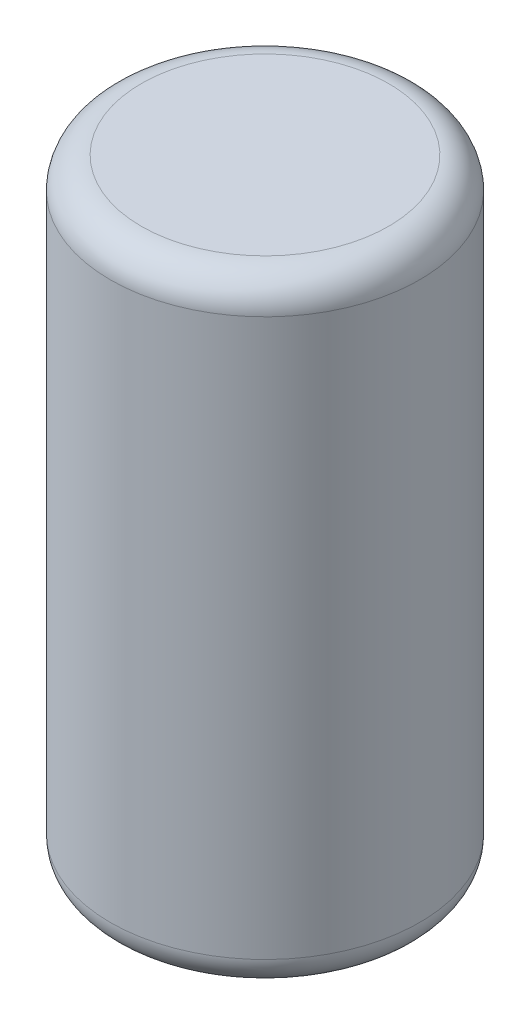
ISO-10303-21;
HEADER;
FILE_DESCRIPTION(('STEP AP214'),'2;1');
FILE_NAME('part.step','',(''),(''),'','','');
FILE_SCHEMA(('AUTOMOTIVE_DESIGN { 1 0 10303 214 1 1 1 1 }'));
ENDSEC;
DATA;
#1=APPLICATION_CONTEXT('core data for automotive mechanical design processes');
#2=APPLICATION_PROTOCOL_DEFINITION('international standard','automotive_design',2000,#1);
#3=PRODUCT_CONTEXT('',#1,'mechanical');
#4=PRODUCT('Part','Part','',(#3));
#5=PRODUCT_RELATED_PRODUCT_CATEGORY('part','',(#4));
#6=PRODUCT_DEFINITION_FORMATION('','',#4);
#7=PRODUCT_DEFINITION_CONTEXT('part definition',#1,'design');
#8=PRODUCT_DEFINITION('design','',#6,#7);
#9=PRODUCT_DEFINITION_SHAPE('','',#8);
#10=(LENGTH_UNIT() NAMED_UNIT(*) SI_UNIT(.MILLI.,.METRE.));
#11=(NAMED_UNIT(*) PLANE_ANGLE_UNIT() SI_UNIT($,.RADIAN.));
#12=(NAMED_UNIT(*) SI_UNIT($,.STERADIAN.) SOLID_ANGLE_UNIT());
#13=UNCERTAINTY_MEASURE_WITH_UNIT(LENGTH_MEASURE(1.E-05),#10,'distance_accuracy_value','');
#14=(GEOMETRIC_REPRESENTATION_CONTEXT(3) GLOBAL_UNCERTAINTY_ASSIGNED_CONTEXT((#13)) GLOBAL_UNIT_ASSIGNED_CONTEXT((#10,
#11,#12)) REPRESENTATION_CONTEXT('',''));
#15=CARTESIAN_POINT('',(0.,0.,0.));
#16=DIRECTION('',(0.,0.,1.));
#17=DIRECTION('',(1.,0.,0.));
#18=AXIS2_PLACEMENT_3D('',#15,#16,#17);
#19=CARTESIAN_POINT('',(0.,12.7,0.));
#20=DIRECTION('',(0.,-1.,0.));
#21=DIRECTION('',(0.,0.,-1.));
#22=AXIS2_PLACEMENT_3D('',#19,#20,#21);
#23=CYLINDRICAL_SURFACE('',#22,3.175);
#24=CARTESIAN_POINT('',(0.,0.635,0.));
#25=DIRECTION('',(0.,1.,0.));
#26=DIRECTION('',(0.,0.,1.));
#27=AXIS2_PLACEMENT_3D('',#24,#25,#26);
#28=CIRCLE('',#27,3.175);
#29=CARTESIAN_POINT('',(0.,0.635,3.175));
#30=VERTEX_POINT('',#29);
#31=EDGE_CURVE('E53',#30,#30,#28,.T.);
#32=ORIENTED_EDGE('',*,*,#31,.T.);
#33=EDGE_LOOP('',(#32));
#34=FACE_BOUND('',#33,.T.);
#35=CARTESIAN_POINT('',(0.,12.065,0.));
#36=DIRECTION('',(0.,1.,0.));
#37=DIRECTION('',(0.,0.,1.));
#38=AXIS2_PLACEMENT_3D('',#35,#36,#37);
#39=CIRCLE('',#38,3.175);
#40=CARTESIAN_POINT('',(0.,12.065,3.175));
#41=VERTEX_POINT('',#40);
#42=EDGE_CURVE('E57',#41,#41,#39,.F.);
#43=ORIENTED_EDGE('',*,*,#42,.T.);
#44=EDGE_LOOP('',(#43));
#45=FACE_BOUND('',#44,.T.);
#46=ADVANCED_FACE('F42',(#34,#45),#23,.T.);
#47=CARTESIAN_POINT('',(0.,12.7,0.));
#48=DIRECTION('',(0.,1.,0.));
#49=DIRECTION('',(0.,0.,1.));
#50=AXIS2_PLACEMENT_3D('',#47,#48,#49);
#51=PLANE('',#50);
#52=CARTESIAN_POINT('',(0.,12.7,0.));
#53=DIRECTION('',(0.,1.,0.));
#54=DIRECTION('',(0.,0.,1.));
#55=AXIS2_PLACEMENT_3D('',#52,#53,#54);
#56=CIRCLE('',#55,2.54);
#57=CARTESIAN_POINT('',(0.,12.7,2.54));
#58=VERTEX_POINT('',#57);
#59=EDGE_CURVE('E12',#58,#58,#56,.T.);
#60=ORIENTED_EDGE('',*,*,#59,.T.);
#61=EDGE_LOOP('',(#60));
#62=FACE_BOUND('',#61,.T.);
#63=ADVANCED_FACE('F73',(#62),#51,.T.);
#64=CARTESIAN_POINT('',(0.,0.,0.));
#65=DIRECTION('',(0.,1.,0.));
#66=DIRECTION('',(0.,0.,1.));
#67=AXIS2_PLACEMENT_3D('',#64,#65,#66);
#68=PLANE('',#67);
#69=CARTESIAN_POINT('',(0.,0.,0.));
#70=DIRECTION('',(0.,1.,0.));
#71=DIRECTION('',(0.,0.,1.));
#72=AXIS2_PLACEMENT_3D('',#69,#70,#71);
#73=CIRCLE('',#72,2.54);
#74=CARTESIAN_POINT('',(0.,0.,2.54));
#75=VERTEX_POINT('',#74);
#76=EDGE_CURVE('E49',#75,#75,#73,.F.);
#77=ORIENTED_EDGE('',*,*,#76,.T.);
#78=EDGE_LOOP('',(#77));
#79=FACE_BOUND('',#78,.T.);
#80=ADVANCED_FACE('F70',(#79),#68,.F.);
#81=CARTESIAN_POINT('',(0.,0.635,0.));
#82=DIRECTION('',(0.,1.,0.));
#83=DIRECTION('',(0.,0.,1.));
#84=AXIS2_PLACEMENT_3D('',#81,#82,#83);
#85=TOROIDAL_SURFACE('',#84,2.54,0.635);
#86=ORIENTED_EDGE('',*,*,#76,.F.);
#87=EDGE_LOOP('',(#86));
#88=FACE_BOUND('',#87,.T.);
#89=ORIENTED_EDGE('',*,*,#31,.F.);
#90=EDGE_LOOP('',(#89));
#91=FACE_BOUND('',#90,.T.);
#92=ADVANCED_FACE('F66',(#88,#91),#85,.T.);
#93=CARTESIAN_POINT('',(0.,12.065,0.));
#94=DIRECTION('',(0.,1.,0.));
#95=DIRECTION('',(0.,0.,1.));
#96=AXIS2_PLACEMENT_3D('',#93,#94,#95);
#97=TOROIDAL_SURFACE('',#96,2.54,0.635);
#98=ORIENTED_EDGE('',*,*,#42,.F.);
#99=EDGE_LOOP('',(#98));
#100=FACE_BOUND('',#99,.T.);
#101=ORIENTED_EDGE('',*,*,#59,.F.);
#102=EDGE_LOOP('',(#101));
#103=FACE_BOUND('',#102,.T.);
#104=ADVANCED_FACE('F44',(#100,#103),#97,.T.);
#105=CLOSED_SHELL('',(#46,#63,#80,#92,#104));
#106=MANIFOLD_SOLID_BREP('B2',#105);
#107=ADVANCED_BREP_SHAPE_REPRESENTATION('',(#18,#106),#14);
#108=SHAPE_DEFINITION_REPRESENTATION(#9,#107);
ENDSEC;
END-ISO-10303-21;
